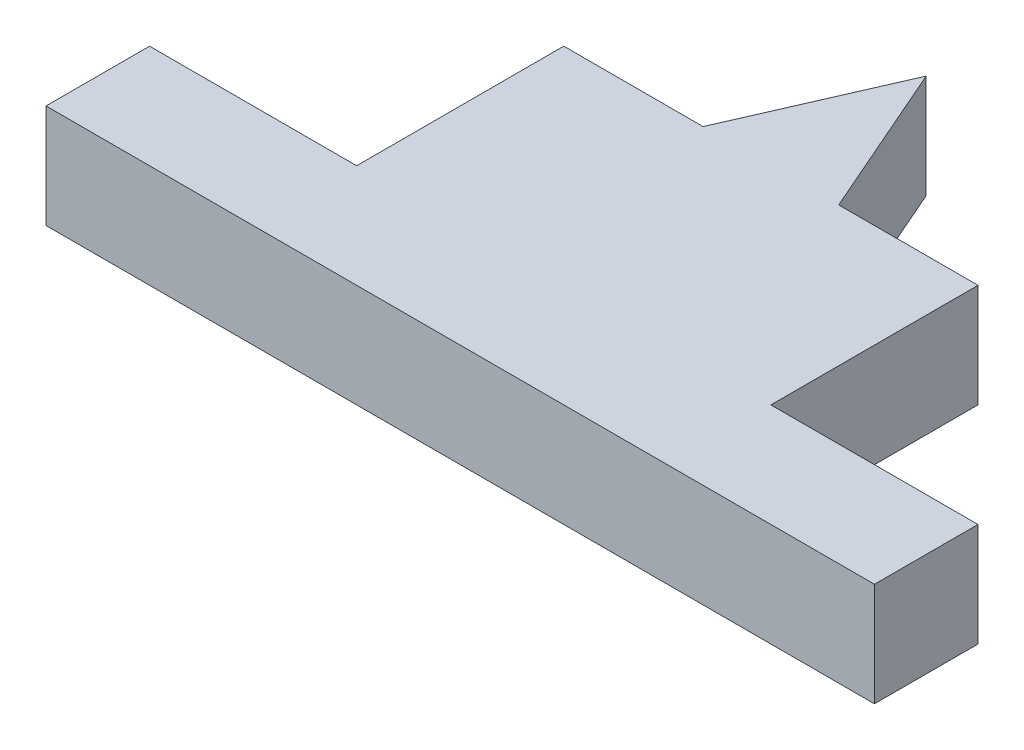
ISO-10303-21;
HEADER;
FILE_DESCRIPTION(('STEP AP214'),'2;1');
FILE_NAME('part.step','',(''),(''),'','','');
FILE_SCHEMA(('AUTOMOTIVE_DESIGN { 1 0 10303 214 1 1 1 1 }'));
ENDSEC;
DATA;
#1=APPLICATION_CONTEXT('core data for automotive mechanical design processes');
#2=APPLICATION_PROTOCOL_DEFINITION('international standard','automotive_design',2000,#1);
#3=PRODUCT_CONTEXT('',#1,'mechanical');
#4=PRODUCT('Part','Part','',(#3));
#5=PRODUCT_RELATED_PRODUCT_CATEGORY('part','',(#4));
#6=PRODUCT_DEFINITION_FORMATION('','',#4);
#7=PRODUCT_DEFINITION_CONTEXT('part definition',#1,'design');
#8=PRODUCT_DEFINITION('design','',#6,#7);
#9=PRODUCT_DEFINITION_SHAPE('','',#8);
#10=(LENGTH_UNIT() NAMED_UNIT(*) SI_UNIT(.MILLI.,.METRE.));
#11=(NAMED_UNIT(*) PLANE_ANGLE_UNIT() SI_UNIT($,.RADIAN.));
#12=(NAMED_UNIT(*) SI_UNIT($,.STERADIAN.) SOLID_ANGLE_UNIT());
#13=UNCERTAINTY_MEASURE_WITH_UNIT(LENGTH_MEASURE(1.E-05),#10,'distance_accuracy_value','');
#14=(GEOMETRIC_REPRESENTATION_CONTEXT(3) GLOBAL_UNCERTAINTY_ASSIGNED_CONTEXT((#13)) GLOBAL_UNIT_ASSIGNED_CONTEXT((#10,
#11,#12)) REPRESENTATION_CONTEXT('',''));
#15=CARTESIAN_POINT('',(0.,0.,0.));
#16=DIRECTION('',(0.,0.,1.));
#17=DIRECTION('',(1.,0.,0.));
#18=AXIS2_PLACEMENT_3D('',#15,#16,#17);
#19=CARTESIAN_POINT('',(12.7,3.175,-1.5875));
#20=DIRECTION('',(-1.,0.,0.));
#21=DIRECTION('',(0.,0.,1.));
#22=AXIS2_PLACEMENT_3D('',#19,#20,#21);
#23=PLANE('',#22);
#24=DIRECTION('',(0.,0.,-1.));
#25=VECTOR('',#24,1.);
#26=CARTESIAN_POINT('',(12.7,0.,-1.5875));
#27=LINE('',#26,#25);
#28=CARTESIAN_POINT('',(12.7,0.,1.5875));
#29=VERTEX_POINT('',#28);
#30=CARTESIAN_POINT('',(12.7,0.,-1.5875));
#31=VERTEX_POINT('',#30);
#32=EDGE_CURVE('E147',#29,#31,#27,.T.);
#33=ORIENTED_EDGE('',*,*,#32,.T.);
#34=DIRECTION('',(0.,-1.,0.));
#35=VECTOR('',#34,1.);
#36=CARTESIAN_POINT('',(12.7,3.175,-1.5875));
#37=LINE('',#36,#35);
#38=CARTESIAN_POINT('',(12.7,3.175,-1.5875));
#39=VERTEX_POINT('',#38);
#40=EDGE_CURVE('E11',#39,#31,#37,.T.);
#41=ORIENTED_EDGE('',*,*,#40,.F.);
#42=DIRECTION('',(0.,0.,-1.));
#43=VECTOR('',#42,1.);
#44=CARTESIAN_POINT('',(12.7,3.175,-1.5875));
#45=LINE('',#44,#43);
#46=CARTESIAN_POINT('',(12.7,3.175,1.5875));
#47=VERTEX_POINT('',#46);
#48=EDGE_CURVE('E167',#47,#39,#45,.T.);
#49=ORIENTED_EDGE('',*,*,#48,.F.);
#50=DIRECTION('',(0.,-1.,0.));
#51=VECTOR('',#50,1.);
#52=CARTESIAN_POINT('',(12.7,3.175,1.5875));
#53=LINE('',#52,#51);
#54=EDGE_CURVE('E143',#47,#29,#53,.T.);
#55=ORIENTED_EDGE('',*,*,#54,.T.);
#56=EDGE_LOOP('',(#33,#41,#49,#55));
#57=FACE_BOUND('',#56,.T.);
#58=ADVANCED_FACE('F33',(#57),#23,.F.);
#59=CARTESIAN_POINT('',(6.35,3.175,-1.5875));
#60=DIRECTION('',(0.,0.,1.));
#61=DIRECTION('',(1.,0.,0.));
#62=AXIS2_PLACEMENT_3D('',#59,#60,#61);
#63=PLANE('',#62);
#64=DIRECTION('',(-1.,0.,0.));
#65=VECTOR('',#64,1.);
#66=CARTESIAN_POINT('',(6.35,0.,-1.5875));
#67=LINE('',#66,#65);
#68=CARTESIAN_POINT('',(6.35,0.,-1.5875));
#69=VERTEX_POINT('',#68);
#70=EDGE_CURVE('E150',#31,#69,#67,.T.);
#71=ORIENTED_EDGE('',*,*,#70,.T.);
#72=DIRECTION('',(0.,-1.,0.));
#73=VECTOR('',#72,1.);
#74=CARTESIAN_POINT('',(6.35,3.175,-1.5875));
#75=LINE('',#74,#73);
#76=CARTESIAN_POINT('',(6.35,3.175,-1.5875));
#77=VERTEX_POINT('',#76);
#78=EDGE_CURVE('E41',#77,#69,#75,.T.);
#79=ORIENTED_EDGE('',*,*,#78,.F.);
#80=DIRECTION('',(-1.,0.,0.));
#81=VECTOR('',#80,1.);
#82=CARTESIAN_POINT('',(6.35,3.175,-1.5875));
#83=LINE('',#82,#81);
#84=EDGE_CURVE('E101',#39,#77,#83,.T.);
#85=ORIENTED_EDGE('',*,*,#84,.F.);
#86=ORIENTED_EDGE('',*,*,#40,.T.);
#87=EDGE_LOOP('',(#71,#79,#85,#86));
#88=FACE_BOUND('',#87,.T.);
#89=ADVANCED_FACE('F239',(#88),#63,.F.);
#90=CARTESIAN_POINT('',(6.35,3.175,-1.5875));
#91=DIRECTION('',(-1.,0.,0.));
#92=DIRECTION('',(0.,0.,1.));
#93=AXIS2_PLACEMENT_3D('',#90,#91,#92);
#94=PLANE('',#93);
#95=DIRECTION('',(0.,0.,-1.));
#96=VECTOR('',#95,1.);
#97=CARTESIAN_POINT('',(6.35,0.,-1.5875));
#98=LINE('',#97,#96);
#99=CARTESIAN_POINT('',(6.35,0.,-7.9375));
#100=VERTEX_POINT('',#99);
#101=EDGE_CURVE('E152',#69,#100,#98,.T.);
#102=ORIENTED_EDGE('',*,*,#101,.T.);
#103=DIRECTION('',(0.,-1.,0.));
#104=VECTOR('',#103,1.);
#105=CARTESIAN_POINT('',(6.35,3.175,-7.9375));
#106=LINE('',#105,#104);
#107=CARTESIAN_POINT('',(6.35,3.175,-7.9375));
#108=VERTEX_POINT('',#107);
#109=EDGE_CURVE('E183',#108,#100,#106,.T.);
#110=ORIENTED_EDGE('',*,*,#109,.F.);
#111=DIRECTION('',(0.,0.,-1.));
#112=VECTOR('',#111,1.);
#113=CARTESIAN_POINT('',(6.35,3.175,-1.5875));
#114=LINE('',#113,#112);
#115=EDGE_CURVE('E191',#77,#108,#114,.T.);
#116=ORIENTED_EDGE('',*,*,#115,.F.);
#117=ORIENTED_EDGE('',*,*,#78,.T.);
#118=EDGE_LOOP('',(#102,#110,#116,#117));
#119=FACE_BOUND('',#118,.T.);
#120=ADVANCED_FACE('F189',(#119),#94,.F.);
#121=CARTESIAN_POINT('',(6.35,3.175,-7.9375));
#122=DIRECTION('',(0.,0.,1.));
#123=DIRECTION('',(1.,0.,0.));
#124=AXIS2_PLACEMENT_3D('',#121,#122,#123);
#125=PLANE('',#124);
#126=DIRECTION('',(-1.,0.,0.));
#127=VECTOR('',#126,1.);
#128=CARTESIAN_POINT('',(6.35,0.,-7.9375));
#129=LINE('',#128,#127);
#130=CARTESIAN_POINT('',(2.07923603326708,0.,-7.9375));
#131=VERTEX_POINT('',#130);
#132=EDGE_CURVE('E154',#100,#131,#129,.T.);
#133=ORIENTED_EDGE('',*,*,#132,.T.);
#134=DIRECTION('',(0.,-1.,0.));
#135=VECTOR('',#134,1.);
#136=CARTESIAN_POINT('',(2.07923603326708,3.175,-7.9375));
#137=LINE('',#136,#135);
#138=CARTESIAN_POINT('',(2.07923603326708,3.175,-7.9375));
#139=VERTEX_POINT('',#138);
#140=EDGE_CURVE('E180',#139,#131,#137,.T.);
#141=ORIENTED_EDGE('',*,*,#140,.F.);
#142=DIRECTION('',(-1.,0.,0.));
#143=VECTOR('',#142,1.);
#144=CARTESIAN_POINT('',(6.35,3.175,-7.9375));
#145=LINE('',#144,#143);
#146=EDGE_CURVE('E209',#108,#139,#145,.T.);
#147=ORIENTED_EDGE('',*,*,#146,.F.);
#148=ORIENTED_EDGE('',*,*,#109,.T.);
#149=EDGE_LOOP('',(#133,#141,#147,#148));
#150=FACE_BOUND('',#149,.T.);
#151=ADVANCED_FACE('F200',(#150),#125,.F.);
#152=CARTESIAN_POINT('',(0.,3.175,-12.7));
#153=DIRECTION('',(-0.91646499883656,0.,0.400114865891663));
#154=DIRECTION('',(0.400114865891663,0.,0.91646499883656));
#155=AXIS2_PLACEMENT_3D('',#152,#153,#154);
#156=PLANE('',#155);
#157=DIRECTION('',(-0.400114865891663,0.,-0.91646499883656));
#158=VECTOR('',#157,1.);
#159=CARTESIAN_POINT('',(0.,0.,-12.7));
#160=LINE('',#159,#158);
#161=CARTESIAN_POINT('',(0.,0.,-12.7));
#162=VERTEX_POINT('',#161);
#163=EDGE_CURVE('E156',#131,#162,#160,.T.);
#164=ORIENTED_EDGE('',*,*,#163,.T.);
#165=DIRECTION('',(0.,-1.,0.));
#166=VECTOR('',#165,1.);
#167=CARTESIAN_POINT('',(0.,3.175,-12.7));
#168=LINE('',#167,#166);
#169=CARTESIAN_POINT('',(0.,3.175,-12.7));
#170=VERTEX_POINT('',#169);
#171=EDGE_CURVE('E177',#170,#162,#168,.T.);
#172=ORIENTED_EDGE('',*,*,#171,.F.);
#173=DIRECTION('',(-0.400114865891663,0.,-0.91646499883656));
#174=VECTOR('',#173,1.);
#175=CARTESIAN_POINT('',(0.,3.175,-12.7));
#176=LINE('',#175,#174);
#177=EDGE_CURVE('E206',#139,#170,#176,.T.);
#178=ORIENTED_EDGE('',*,*,#177,.F.);
#179=ORIENTED_EDGE('',*,*,#140,.T.);
#180=EDGE_LOOP('',(#164,#172,#178,#179));
#181=FACE_BOUND('',#180,.T.);
#182=ADVANCED_FACE('F204',(#181),#156,.F.);
#183=CARTESIAN_POINT('',(-2.07923603326708,3.175,-7.9375));
#184=DIRECTION('',(0.91646499883656,0.,0.400114865891663));
#185=DIRECTION('',(0.400114865891663,0.,-0.91646499883656));
#186=AXIS2_PLACEMENT_3D('',#183,#184,#185);
#187=PLANE('',#186);
#188=DIRECTION('',(-0.400114865891663,0.,0.91646499883656));
#189=VECTOR('',#188,1.);
#190=CARTESIAN_POINT('',(-2.07923603326708,0.,-7.9375));
#191=LINE('',#190,#189);
#192=CARTESIAN_POINT('',(-2.07923603326708,0.,-7.9375));
#193=VERTEX_POINT('',#192);
#194=EDGE_CURVE('E158',#162,#193,#191,.T.);
#195=ORIENTED_EDGE('',*,*,#194,.T.);
#196=DIRECTION('',(0.,-1.,0.));
#197=VECTOR('',#196,1.);
#198=CARTESIAN_POINT('',(-2.07923603326708,3.175,-7.9375));
#199=LINE('',#198,#197);
#200=CARTESIAN_POINT('',(-2.07923603326708,3.175,-7.9375));
#201=VERTEX_POINT('',#200);
#202=EDGE_CURVE('E174',#201,#193,#199,.T.);
#203=ORIENTED_EDGE('',*,*,#202,.F.);
#204=DIRECTION('',(-0.400114865891663,0.,0.91646499883656));
#205=VECTOR('',#204,1.);
#206=CARTESIAN_POINT('',(-2.07923603326708,3.175,-7.9375));
#207=LINE('',#206,#205);
#208=EDGE_CURVE('E208',#170,#201,#207,.T.);
#209=ORIENTED_EDGE('',*,*,#208,.F.);
#210=ORIENTED_EDGE('',*,*,#171,.T.);
#211=EDGE_LOOP('',(#195,#203,#209,#210));
#212=FACE_BOUND('',#211,.T.);
#213=ADVANCED_FACE('F252',(#212),#187,.F.);
#214=CARTESIAN_POINT('',(-6.35,3.175,-7.9375));
#215=DIRECTION('',(0.,0.,1.));
#216=DIRECTION('',(1.,0.,0.));
#217=AXIS2_PLACEMENT_3D('',#214,#215,#216);
#218=PLANE('',#217);
#219=DIRECTION('',(-1.,0.,0.));
#220=VECTOR('',#219,1.);
#221=CARTESIAN_POINT('',(-6.35,0.,-7.9375));
#222=LINE('',#221,#220);
#223=CARTESIAN_POINT('',(-6.35,0.,-7.9375));
#224=VERTEX_POINT('',#223);
#225=EDGE_CURVE('E160',#193,#224,#222,.T.);
#226=ORIENTED_EDGE('',*,*,#225,.T.);
#227=DIRECTION('',(0.,-1.,0.));
#228=VECTOR('',#227,1.);
#229=CARTESIAN_POINT('',(-6.35,3.175,-7.9375));
#230=LINE('',#229,#228);
#231=CARTESIAN_POINT('',(-6.35,3.175,-7.9375));
#232=VERTEX_POINT('',#231);
#233=EDGE_CURVE('E171',#232,#224,#230,.T.);
#234=ORIENTED_EDGE('',*,*,#233,.F.);
#235=DIRECTION('',(-1.,0.,0.));
#236=VECTOR('',#235,1.);
#237=CARTESIAN_POINT('',(-6.35,3.175,-7.9375));
#238=LINE('',#237,#236);
#239=EDGE_CURVE('E211',#201,#232,#238,.T.);
#240=ORIENTED_EDGE('',*,*,#239,.F.);
#241=ORIENTED_EDGE('',*,*,#202,.T.);
#242=EDGE_LOOP('',(#226,#234,#240,#241));
#243=FACE_BOUND('',#242,.T.);
#244=ADVANCED_FACE('F220',(#243),#218,.F.);
#245=CARTESIAN_POINT('',(-6.35,3.175,-1.5875));
#246=DIRECTION('',(1.,0.,0.));
#247=DIRECTION('',(0.,0.,-1.));
#248=AXIS2_PLACEMENT_3D('',#245,#246,#247);
#249=PLANE('',#248);
#250=DIRECTION('',(0.,0.,1.));
#251=VECTOR('',#250,1.);
#252=CARTESIAN_POINT('',(-6.35,0.,-1.5875));
#253=LINE('',#252,#251);
#254=CARTESIAN_POINT('',(-6.35,0.,-1.5875));
#255=VERTEX_POINT('',#254);
#256=EDGE_CURVE('E162',#224,#255,#253,.T.);
#257=ORIENTED_EDGE('',*,*,#256,.T.);
#258=DIRECTION('',(0.,-1.,0.));
#259=VECTOR('',#258,1.);
#260=CARTESIAN_POINT('',(-6.35,3.175,-1.5875));
#261=LINE('',#260,#259);
#262=CARTESIAN_POINT('',(-6.35,3.175,-1.5875));
#263=VERTEX_POINT('',#262);
#264=EDGE_CURVE('E138',#263,#255,#261,.T.);
#265=ORIENTED_EDGE('',*,*,#264,.F.);
#266=DIRECTION('',(0.,0.,1.));
#267=VECTOR('',#266,1.);
#268=CARTESIAN_POINT('',(-6.35,3.175,-1.5875));
#269=LINE('',#268,#267);
#270=EDGE_CURVE('E129',#232,#263,#269,.T.);
#271=ORIENTED_EDGE('',*,*,#270,.F.);
#272=ORIENTED_EDGE('',*,*,#233,.T.);
#273=EDGE_LOOP('',(#257,#265,#271,#272));
#274=FACE_BOUND('',#273,.T.);
#275=ADVANCED_FACE('F224',(#274),#249,.F.);
#276=CARTESIAN_POINT('',(-12.7,3.175,-1.5875));
#277=DIRECTION('',(0.,0.,1.));
#278=DIRECTION('',(1.,0.,0.));
#279=AXIS2_PLACEMENT_3D('',#276,#277,#278);
#280=PLANE('',#279);
#281=DIRECTION('',(-1.,0.,0.));
#282=VECTOR('',#281,1.);
#283=CARTESIAN_POINT('',(-12.7,0.,-1.5875));
#284=LINE('',#283,#282);
#285=CARTESIAN_POINT('',(-12.7,0.,-1.5875));
#286=VERTEX_POINT('',#285);
#287=EDGE_CURVE('E137',#255,#286,#284,.T.);
#288=ORIENTED_EDGE('',*,*,#287,.T.);
#289=DIRECTION('',(0.,-1.,0.));
#290=VECTOR('',#289,1.);
#291=CARTESIAN_POINT('',(-12.7,3.175,-1.5875));
#292=LINE('',#291,#290);
#293=CARTESIAN_POINT('',(-12.7,3.175,-1.5875));
#294=VERTEX_POINT('',#293);
#295=EDGE_CURVE('E134',#294,#286,#292,.T.);
#296=ORIENTED_EDGE('',*,*,#295,.F.);
#297=DIRECTION('',(-1.,0.,0.));
#298=VECTOR('',#297,1.);
#299=CARTESIAN_POINT('',(-12.7,3.175,-1.5875));
#300=LINE('',#299,#298);
#301=EDGE_CURVE('E123',#263,#294,#300,.T.);
#302=ORIENTED_EDGE('',*,*,#301,.F.);
#303=ORIENTED_EDGE('',*,*,#264,.T.);
#304=EDGE_LOOP('',(#288,#296,#302,#303));
#305=FACE_BOUND('',#304,.T.);
#306=ADVANCED_FACE('F135',(#305),#280,.F.);
#307=CARTESIAN_POINT('',(-12.7,3.175,-1.5875));
#308=DIRECTION('',(1.,0.,0.));
#309=DIRECTION('',(0.,0.,-1.));
#310=AXIS2_PLACEMENT_3D('',#307,#308,#309);
#311=PLANE('',#310);
#312=DIRECTION('',(0.,0.,1.));
#313=VECTOR('',#312,1.);
#314=CARTESIAN_POINT('',(-12.7,0.,-1.5875));
#315=LINE('',#314,#313);
#316=CARTESIAN_POINT('',(-12.7,0.,1.5875));
#317=VERTEX_POINT('',#316);
#318=EDGE_CURVE('E87',#286,#317,#315,.T.);
#319=ORIENTED_EDGE('',*,*,#318,.T.);
#320=DIRECTION('',(0.,-1.,0.));
#321=VECTOR('',#320,1.);
#322=CARTESIAN_POINT('',(-12.7,3.175,1.5875));
#323=LINE('',#322,#321);
#324=CARTESIAN_POINT('',(-12.7,3.175,1.5875));
#325=VERTEX_POINT('',#324);
#326=EDGE_CURVE('E139',#325,#317,#323,.T.);
#327=ORIENTED_EDGE('',*,*,#326,.F.);
#328=DIRECTION('',(0.,0.,1.));
#329=VECTOR('',#328,1.);
#330=CARTESIAN_POINT('',(-12.7,3.175,-1.5875));
#331=LINE('',#330,#329);
#332=EDGE_CURVE('E127',#294,#325,#331,.T.);
#333=ORIENTED_EDGE('',*,*,#332,.F.);
#334=ORIENTED_EDGE('',*,*,#295,.T.);
#335=EDGE_LOOP('',(#319,#327,#333,#334));
#336=FACE_BOUND('',#335,.T.);
#337=ADVANCED_FACE('F141',(#336),#311,.F.);
#338=CARTESIAN_POINT('',(-12.7,3.175,1.5875));
#339=DIRECTION('',(0.,0.,-1.));
#340=DIRECTION('',(-1.,0.,0.));
#341=AXIS2_PLACEMENT_3D('',#338,#339,#340);
#342=PLANE('',#341);
#343=DIRECTION('',(1.,0.,0.));
#344=VECTOR('',#343,1.);
#345=CARTESIAN_POINT('',(-12.7,0.,1.5875));
#346=LINE('',#345,#344);
#347=EDGE_CURVE('E93',#317,#29,#346,.T.);
#348=ORIENTED_EDGE('',*,*,#347,.T.);
#349=ORIENTED_EDGE('',*,*,#54,.F.);
#350=DIRECTION('',(1.,0.,0.));
#351=VECTOR('',#350,1.);
#352=CARTESIAN_POINT('',(-12.7,3.175,1.5875));
#353=LINE('',#352,#351);
#354=EDGE_CURVE('E49',#325,#47,#353,.T.);
#355=ORIENTED_EDGE('',*,*,#354,.F.);
#356=ORIENTED_EDGE('',*,*,#326,.T.);
#357=EDGE_LOOP('',(#348,#349,#355,#356));
#358=FACE_BOUND('',#357,.T.);
#359=ADVANCED_FACE('F228',(#358),#342,.F.);
#360=CARTESIAN_POINT('',(0.,3.175,0.));
#361=DIRECTION('',(0.,1.,0.));
#362=DIRECTION('',(0.,0.,1.));
#363=AXIS2_PLACEMENT_3D('',#360,#361,#362);
#364=PLANE('',#363);
#365=ORIENTED_EDGE('',*,*,#48,.T.);
#366=ORIENTED_EDGE('',*,*,#84,.T.);
#367=ORIENTED_EDGE('',*,*,#115,.T.);
#368=ORIENTED_EDGE('',*,*,#146,.T.);
#369=ORIENTED_EDGE('',*,*,#177,.T.);
#370=ORIENTED_EDGE('',*,*,#208,.T.);
#371=ORIENTED_EDGE('',*,*,#239,.T.);
#372=ORIENTED_EDGE('',*,*,#270,.T.);
#373=ORIENTED_EDGE('',*,*,#301,.T.);
#374=ORIENTED_EDGE('',*,*,#332,.T.);
#375=ORIENTED_EDGE('',*,*,#354,.T.);
#376=EDGE_LOOP('',(#365,#366,#367,#368,#369,#370,#371,#372,#373,#374,#375));
#377=FACE_BOUND('',#376,.T.);
#378=ADVANCED_FACE('F125',(#377),#364,.T.);
#379=CARTESIAN_POINT('',(0.,0.,0.));
#380=DIRECTION('',(0.,1.,0.));
#381=DIRECTION('',(0.,0.,1.));
#382=AXIS2_PLACEMENT_3D('',#379,#380,#381);
#383=PLANE('',#382);
#384=ORIENTED_EDGE('',*,*,#32,.F.);
#385=ORIENTED_EDGE('',*,*,#347,.F.);
#386=ORIENTED_EDGE('',*,*,#318,.F.);
#387=ORIENTED_EDGE('',*,*,#287,.F.);
#388=ORIENTED_EDGE('',*,*,#256,.F.);
#389=ORIENTED_EDGE('',*,*,#225,.F.);
#390=ORIENTED_EDGE('',*,*,#194,.F.);
#391=ORIENTED_EDGE('',*,*,#163,.F.);
#392=ORIENTED_EDGE('',*,*,#132,.F.);
#393=ORIENTED_EDGE('',*,*,#101,.F.);
#394=ORIENTED_EDGE('',*,*,#70,.F.);
#395=EDGE_LOOP('',(#384,#385,#386,#387,#388,#389,#390,#391,#392,#393,#394));
#396=FACE_BOUND('',#395,.T.);
#397=ADVANCED_FACE('F195',(#396),#383,.F.);
#398=CLOSED_SHELL('',(#58,#89,#120,#151,#182,#213,#244,#275,#306,#337,#359,#378,#397));
#399=MANIFOLD_SOLID_BREP('B2',#398);
#400=ADVANCED_BREP_SHAPE_REPRESENTATION('',(#18,#399),#14);
#401=SHAPE_DEFINITION_REPRESENTATION(#9,#400);
ENDSEC;
END-ISO-10303-21;
